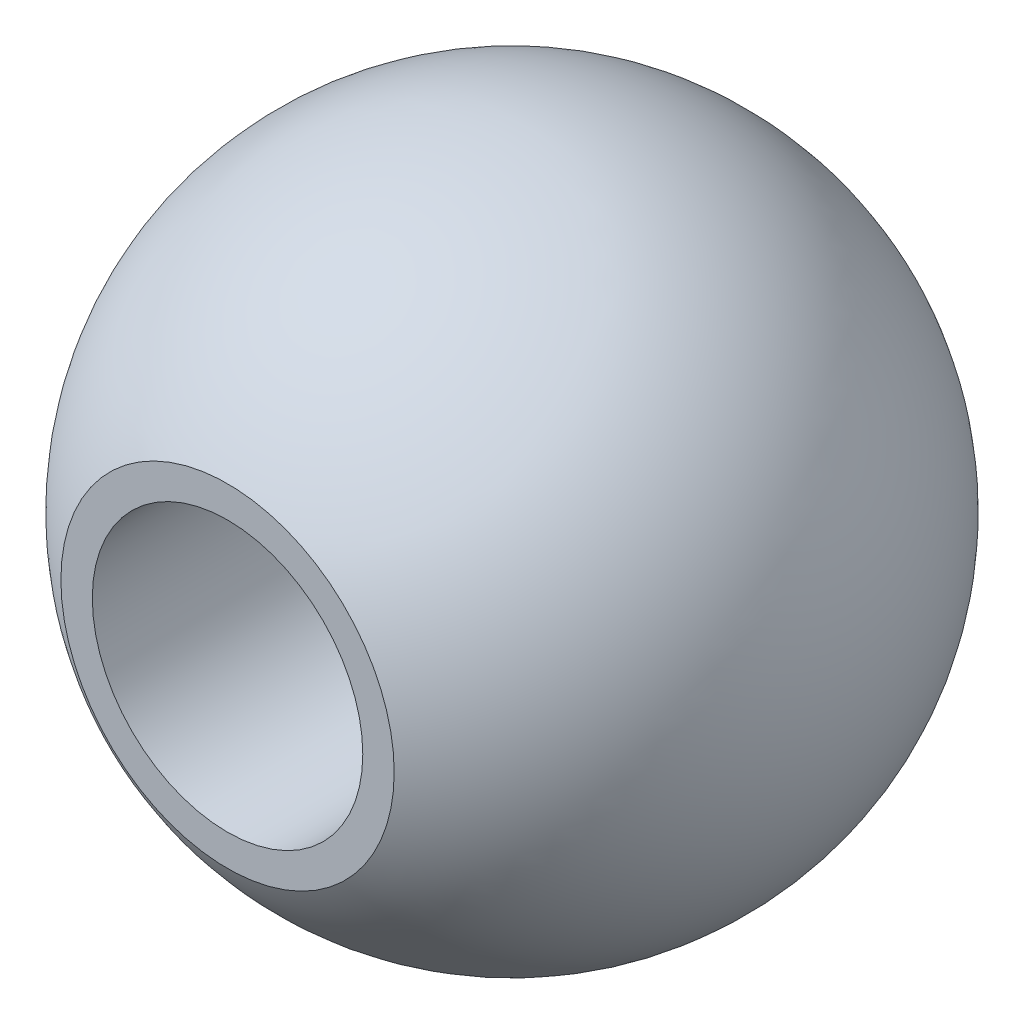
ISO-10303-21;
HEADER;
FILE_DESCRIPTION(('STEP AP214'),'2;1');
FILE_NAME('part.step','',(''),(''),'','','');
FILE_SCHEMA(('AUTOMOTIVE_DESIGN { 1 0 10303 214 1 1 1 1 }'));
ENDSEC;
DATA;
#1=APPLICATION_CONTEXT('core data for automotive mechanical design processes');
#2=APPLICATION_PROTOCOL_DEFINITION('international standard','automotive_design',2000,#1);
#3=PRODUCT_CONTEXT('',#1,'mechanical');
#4=PRODUCT('Part','Part','',(#3));
#5=PRODUCT_RELATED_PRODUCT_CATEGORY('part','',(#4));
#6=PRODUCT_DEFINITION_FORMATION('','',#4);
#7=PRODUCT_DEFINITION_CONTEXT('part definition',#1,'design');
#8=PRODUCT_DEFINITION('design','',#6,#7);
#9=PRODUCT_DEFINITION_SHAPE('','',#8);
#10=(LENGTH_UNIT() NAMED_UNIT(*) SI_UNIT(.MILLI.,.METRE.));
#11=(NAMED_UNIT(*) PLANE_ANGLE_UNIT() SI_UNIT($,.RADIAN.));
#12=(NAMED_UNIT(*) SI_UNIT($,.STERADIAN.) SOLID_ANGLE_UNIT());
#13=UNCERTAINTY_MEASURE_WITH_UNIT(LENGTH_MEASURE(1.E-05),#10,'distance_accuracy_value','');
#14=(GEOMETRIC_REPRESENTATION_CONTEXT(3) GLOBAL_UNCERTAINTY_ASSIGNED_CONTEXT((#13)) GLOBAL_UNIT_ASSIGNED_CONTEXT((#10,
#11,#12)) REPRESENTATION_CONTEXT('',''));
#15=CARTESIAN_POINT('',(0.,0.,0.));
#16=DIRECTION('',(0.,0.,1.));
#17=DIRECTION('',(1.,0.,0.));
#18=AXIS2_PLACEMENT_3D('',#15,#16,#17);
#19=CARTESIAN_POINT('',(0.,0.,-3.365));
#20=DIRECTION('',(0.,0.,1.));
#21=DIRECTION('',(1.,0.,0.));
#22=AXIS2_PLACEMENT_3D('',#19,#20,#21);
#23=PLANE('',#22);
#24=CARTESIAN_POINT('',(0.,0.,-3.365));
#25=DIRECTION('',(0.,0.,1.));
#26=DIRECTION('',(1.,0.,0.));
#27=AXIS2_PLACEMENT_3D('',#24,#25,#26);
#28=CIRCLE('',#27,1.6);
#29=CARTESIAN_POINT('',(1.6,0.,-3.365));
#30=VERTEX_POINT('',#29);
#31=EDGE_CURVE('E41',#30,#30,#28,.F.);
#32=ORIENTED_EDGE('',*,*,#31,.F.);
#33=EDGE_LOOP('',(#32));
#34=FACE_BOUND('',#33,.T.);
#35=CARTESIAN_POINT('',(0.,0.,-3.365));
#36=DIRECTION('',(0.,0.,-1.));
#37=DIRECTION('',(-1.,0.,0.));
#38=AXIS2_PLACEMENT_3D('',#35,#36,#37);
#39=CIRCLE('',#38,1.97149055285588);
#40=CARTESIAN_POINT('',(1.97149055285588,0.,-3.365));
#41=VERTEX_POINT('',#40);
#42=EDGE_CURVE('E37',#41,#41,#39,.T.);
#43=ORIENTED_EDGE('',*,*,#42,.T.);
#44=EDGE_LOOP('',(#43));
#45=FACE_BOUND('',#44,.T.);
#46=ADVANCED_FACE('F31',(#34,#45),#23,.F.);
#47=CARTESIAN_POINT('',(0.,0.,3.365));
#48=DIRECTION('',(0.,0.,-1.));
#49=DIRECTION('',(-1.,0.,0.));
#50=AXIS2_PLACEMENT_3D('',#47,#48,#49);
#51=PLANE('',#50);
#52=CARTESIAN_POINT('',(0.,0.,3.365));
#53=DIRECTION('',(0.,0.,1.));
#54=DIRECTION('',(1.,0.,0.));
#55=AXIS2_PLACEMENT_3D('',#52,#53,#54);
#56=CIRCLE('',#55,1.6);
#57=CARTESIAN_POINT('',(1.6,0.,3.365));
#58=VERTEX_POINT('',#57);
#59=EDGE_CURVE('E45',#58,#58,#56,.T.);
#60=ORIENTED_EDGE('',*,*,#59,.F.);
#61=EDGE_LOOP('',(#60));
#62=FACE_BOUND('',#61,.T.);
#63=CARTESIAN_POINT('',(0.,0.,3.365));
#64=DIRECTION('',(0.,0.,-1.));
#65=DIRECTION('',(-1.,0.,0.));
#66=AXIS2_PLACEMENT_3D('',#63,#64,#65);
#67=CIRCLE('',#66,1.97149055285588);
#68=CARTESIAN_POINT('',(1.97149055285588,0.,3.365));
#69=VERTEX_POINT('',#68);
#70=EDGE_CURVE('E10',#69,#69,#67,.T.);
#71=ORIENTED_EDGE('',*,*,#70,.F.);
#72=EDGE_LOOP('',(#71));
#73=FACE_BOUND('',#72,.T.);
#74=ADVANCED_FACE('F54',(#62,#73),#51,.F.);
#75=CARTESIAN_POINT('',(0.,0.,0.));
#76=DIRECTION('',(0.,0.,-1.));
#77=DIRECTION('',(1.,0.,0.));
#78=AXIS2_PLACEMENT_3D('',#75,#76,#77);
#79=SPHERICAL_SURFACE('',#78,3.9);
#80=CARTESIAN_POINT('',(1.97149055285588,0.,-3.365));
#81=CARTESIAN_POINT('',(2.04445891190278,0.,-3.32225403774394));
#82=CARTESIAN_POINT('',(2.11603226656489,0.,-3.27712797061892));
#83=CARTESIAN_POINT('',(2.25609648171826,0.,-3.18232171247607));
#84=CARTESIAN_POINT('',(2.32458734220952,0.,-3.13264152145824));
#85=CARTESIAN_POINT('',(2.45819408361993,0.,-3.02893310137486));
#86=CARTESIAN_POINT('',(2.52330996453908,0.,-2.97490487230932));
#87=CARTESIAN_POINT('',(2.64989203217054,0.,-2.86273001703068));
#88=CARTESIAN_POINT('',(2.71135821888284,0.,-2.80458339081757));
#89=CARTESIAN_POINT('',(2.83038068619256,0.,-2.68441742062103));
#90=CARTESIAN_POINT('',(2.88793696678997,0.,-2.62239807663761));
#91=CARTESIAN_POINT('',(2.99889620048767,0.,-2.4947491032508));
#92=CARTESIAN_POINT('',(3.05229915358796,0.,-2.42911947384742));
#93=CARTESIAN_POINT('',(3.15472581308588,0.,-2.29452753488296));
#94=CARTESIAN_POINT('',(3.20374951948352,0.,-2.22556522532188));
#95=CARTESIAN_POINT('',(3.29721030945642,0.,-2.08459965580613));
#96=CARTESIAN_POINT('',(3.34164739303169,0.,-2.01259639585146));
#97=CARTESIAN_POINT('',(3.42574695873146,0.,-1.86585351200143));
#98=CARTESIAN_POINT('',(3.46540944085596,0.,-1.79111388810607));
#99=CARTESIAN_POINT('',(3.53979202382261,0.,-1.63921444009594));
#100=CARTESIAN_POINT('',(3.57451212466477,0.,-1.56205461598118));
#101=CARTESIAN_POINT('',(3.63886307213416,0.,-1.40564116866487));
#102=CARTESIAN_POINT('',(3.6684939187614,0.,-1.32638754546333));
#103=CARTESIAN_POINT('',(3.7225410135081,0.,-1.16612175842543));
#104=CARTESIAN_POINT('',(3.74695726162755,0.,-1.08510959458907));
#105=CARTESIAN_POINT('',(3.79047187381885,0.,-0.921669423669714));
#106=CARTESIAN_POINT('',(3.80957023789069,0.,-0.839241416586718));
#107=CARTESIAN_POINT('',(3.84236829214965,0.,-0.673318245867676));
#108=CARTESIAN_POINT('',(3.85606798233676,0.,-0.58982308223163));
#109=CARTESIAN_POINT('',(3.87801073644035,0.,-0.422118799379673));
#110=CARTESIAN_POINT('',(3.88625380035682,0.,-0.337909680163762));
#111=CARTESIAN_POINT('',(3.89724843213664,0.,-0.169133707298567));
#112=CARTESIAN_POINT('',(3.9,0.,-0.0845668536492835));
#113=CARTESIAN_POINT('',(3.9,0.,0.0845668536492836));
#114=CARTESIAN_POINT('',(3.89724843213664,0.,0.169133707298567));
#115=CARTESIAN_POINT('',(3.88625380035682,0.,0.337909680163762));
#116=CARTESIAN_POINT('',(3.87801073644035,0.,0.422118799379673));
#117=CARTESIAN_POINT('',(3.85606798233676,0.,0.58982308223163));
#118=CARTESIAN_POINT('',(3.84236829214965,0.,0.673318245867676));
#119=CARTESIAN_POINT('',(3.80957023789069,0.,0.839241416586718));
#120=CARTESIAN_POINT('',(3.79047187381885,0.,0.921669423669714));
#121=CARTESIAN_POINT('',(3.74695726162755,0.,1.08510959458907));
#122=CARTESIAN_POINT('',(3.7225410135081,0.,1.16612175842543));
#123=CARTESIAN_POINT('',(3.6684939187614,0.,1.32638754546333));
#124=CARTESIAN_POINT('',(3.63886307213416,0.,1.40564116866487));
#125=CARTESIAN_POINT('',(3.57451212466477,0.,1.56205461598118));
#126=CARTESIAN_POINT('',(3.53979202382261,0.,1.63921444009594));
#127=CARTESIAN_POINT('',(3.46540944085596,0.,1.79111388810606));
#128=CARTESIAN_POINT('',(3.42574695873146,0.,1.86585351200143));
#129=CARTESIAN_POINT('',(3.34164739303169,0.,2.01259639585146));
#130=CARTESIAN_POINT('',(3.29721030945642,0.,2.08459965580613));
#131=CARTESIAN_POINT('',(3.20374951948352,0.,2.22556522532188));
#132=CARTESIAN_POINT('',(3.15472581308588,0.,2.29452753488296));
#133=CARTESIAN_POINT('',(3.05229915358796,0.,2.42911947384742));
#134=CARTESIAN_POINT('',(2.99889620048767,0.,2.4947491032508));
#135=CARTESIAN_POINT('',(2.88793696678997,0.,2.62239807663761));
#136=CARTESIAN_POINT('',(2.83038068619256,0.,2.68441742062103));
#137=CARTESIAN_POINT('',(2.71135821888284,0.,2.80458339081757));
#138=CARTESIAN_POINT('',(2.64989203217054,0.,2.86273001703068));
#139=CARTESIAN_POINT('',(2.52330996453908,0.,2.97490487230932));
#140=CARTESIAN_POINT('',(2.45819408361993,0.,3.02893310137486));
#141=CARTESIAN_POINT('',(2.32458734220952,0.,3.13264152145824));
#142=CARTESIAN_POINT('',(2.25609648171826,0.,3.18232171247607));
#143=CARTESIAN_POINT('',(2.11603226656489,0.,3.27712797061892));
#144=CARTESIAN_POINT('',(2.04445891190278,0.,3.32225403774394));
#145=CARTESIAN_POINT('',(1.97149055285588,0.,3.365));
#146=B_SPLINE_CURVE_WITH_KNOTS('',3,(#80,#81,#82,#83,#84,#85,#86,#87,#88,#89,#90,#91,#92,#93,
#94,#95,#96,#97,#98,#99,#100,#101,#102,#103,#104,#105,#106,#107,#108,#109,#110,#111,#112,#113,
#114,#115,#116,#117,#118,#119,#120,#121,#122,#123,#124,#125,#126,#127,#128,#129,#130,#131,#132,
#133,#134,#135,#136,#137,#138,#139,#140,#141,#142,#143,#144,#145),.UNSPECIFIED.,.F.,.F.,(4,2,2,
2,2,2,2,2,2,2,2,2,2,2,2,2,2,2,2,2,2,2,2,2,2,2,2,2,2,2,2,2,4),(0.,0.25365585598502,
0.50731171197004,0.76096756795506,1.01462342394008,1.2682792799251,1.52193513591012,
1.77559099189514,2.02924684788016,2.28290270386518,2.5365585598502,2.79021441583522,
3.04387027182024,3.29752612780526,3.55118198379028,3.8048378397753,4.05849369576032,
4.31214955174534,4.56580540773036,4.81946126371539,5.0731171197004,5.32677297568542,
5.58042883167045,5.83408468765547,6.08774054364049,6.34139639962551,6.59505225561053,
6.84870811159555,7.10236396758057,7.35601982356559,7.60967567955061,7.86333153553563,
8.11698739152065),.UNSPECIFIED.);
#147=EDGE_CURVE('BSEAM57',#41,#69,#146,.T.);
#148=ORIENTED_EDGE('',*,*,#42,.F.);
#149=ORIENTED_EDGE('',*,*,#70,.T.);
#150=ORIENTED_EDGE('',*,*,#147,.T.);
#151=ORIENTED_EDGE('',*,*,#147,.F.);
#152=EDGE_LOOP('',(#148,#150,#149,#151));
#153=FACE_BOUND('',#152,.T.);
#154=ADVANCED_FACE('F57',(#153),#79,.T.);
#155=CARTESIAN_POINT('',(0.,0.,-3.366));
#156=DIRECTION('',(0.,0.,1.));
#157=DIRECTION('',(1.,0.,0.));
#158=AXIS2_PLACEMENT_3D('',#155,#156,#157);
#159=CYLINDRICAL_SURFACE('',#158,1.6);
#160=ORIENTED_EDGE('',*,*,#59,.T.);
#161=EDGE_LOOP('',(#160));
#162=FACE_BOUND('',#161,.T.);
#163=ORIENTED_EDGE('',*,*,#31,.T.);
#164=EDGE_LOOP('',(#163));
#165=FACE_BOUND('',#164,.T.);
#166=ADVANCED_FACE('F51',(#162,#165),#159,.F.);
#167=CLOSED_SHELL('',(#46,#74,#154,#166));
#168=MANIFOLD_SOLID_BREP('B2',#167);
#169=ADVANCED_BREP_SHAPE_REPRESENTATION('',(#18,#168),#14);
#170=SHAPE_DEFINITION_REPRESENTATION(#9,#169);
ENDSEC;
END-ISO-10303-21;
